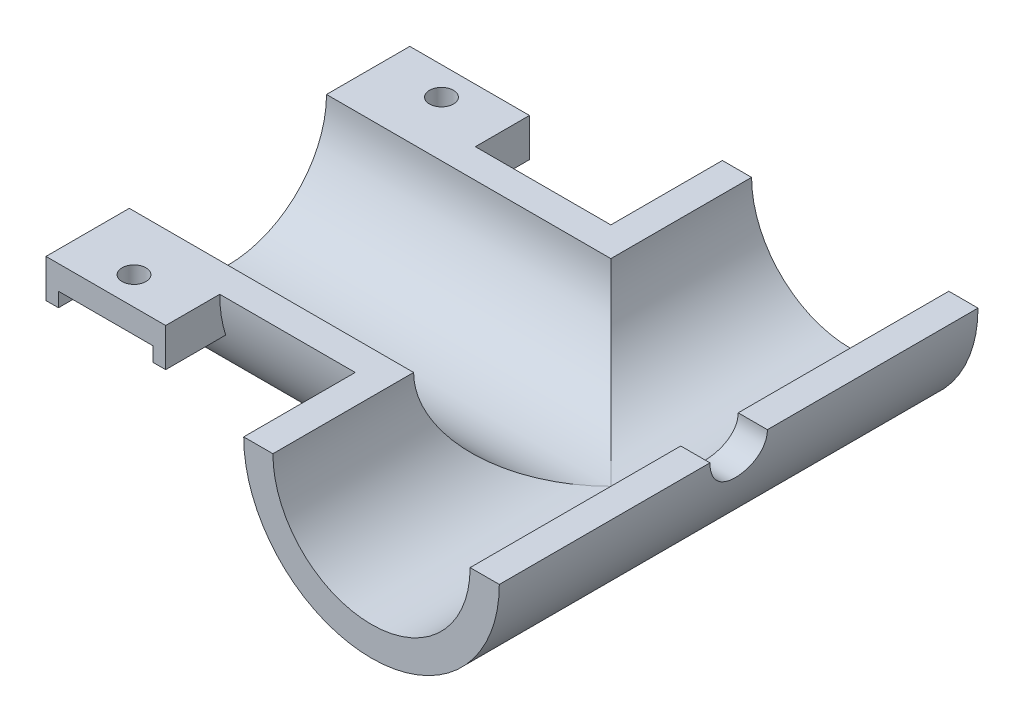
ISO-10303-21;
HEADER;
FILE_DESCRIPTION(('STEP AP214'),'2;1');
FILE_NAME('part.step','',(''),(''),'','','');
FILE_SCHEMA(('AUTOMOTIVE_DESIGN { 1 0 10303 214 1 1 1 1 }'));
ENDSEC;
DATA;
#1=APPLICATION_CONTEXT('core data for automotive mechanical design processes');
#2=APPLICATION_PROTOCOL_DEFINITION('international standard','automotive_design',2000,#1);
#3=PRODUCT_CONTEXT('',#1,'mechanical');
#4=PRODUCT('Part','Part','',(#3));
#5=PRODUCT_RELATED_PRODUCT_CATEGORY('part','',(#4));
#6=PRODUCT_DEFINITION_FORMATION('','',#4);
#7=PRODUCT_DEFINITION_CONTEXT('part definition',#1,'design');
#8=PRODUCT_DEFINITION('design','',#6,#7);
#9=PRODUCT_DEFINITION_SHAPE('','',#8);
#10=(LENGTH_UNIT() NAMED_UNIT(*) SI_UNIT(.MILLI.,.METRE.));
#11=(NAMED_UNIT(*) PLANE_ANGLE_UNIT() SI_UNIT($,.RADIAN.));
#12=(NAMED_UNIT(*) SI_UNIT($,.STERADIAN.) SOLID_ANGLE_UNIT());
#13=UNCERTAINTY_MEASURE_WITH_UNIT(LENGTH_MEASURE(1.E-05),#10,'distance_accuracy_value','');
#14=(GEOMETRIC_REPRESENTATION_CONTEXT(3) GLOBAL_UNCERTAINTY_ASSIGNED_CONTEXT((#13)) GLOBAL_UNIT_ASSIGNED_CONTEXT((#10,
#11,#12)) REPRESENTATION_CONTEXT('',''));
#15=CARTESIAN_POINT('',(0.,0.,0.));
#16=DIRECTION('',(0.,0.,1.));
#17=DIRECTION('',(1.,0.,0.));
#18=AXIS2_PLACEMENT_3D('',#15,#16,#17);
#19=CARTESIAN_POINT('',(1.651,-5.08,31.751));
#20=DIRECTION('',(-1.,0.,0.));
#21=DIRECTION('',(0.,0.,-1.));
#22=AXIS2_PLACEMENT_3D('',#19,#20,#21);
#23=PLANE('',#22);
#24=DIRECTION('',(0.,0.,-1.));
#25=VECTOR('',#24,1.);
#26=CARTESIAN_POINT('',(1.651,-3.175,31.751));
#27=LINE('',#26,#25);
#28=CARTESIAN_POINT('',(1.651,-3.175,-16.6545622953592));
#29=VERTEX_POINT('',#28);
#30=CARTESIAN_POINT('',(1.651,-3.175,-24.13));
#31=VERTEX_POINT('',#30);
#32=EDGE_CURVE('E139',#29,#31,#27,.T.);
#33=ORIENTED_EDGE('',*,*,#32,.F.);
#34=CARTESIAN_POINT('',(1.651,0.,0.));
#35=DIRECTION('',(-1.,0.,0.));
#36=DIRECTION('',(0.,0.,1.));
#37=AXIS2_PLACEMENT_3D('',#34,#35,#36);
#38=CIRCLE('',#37,16.9545);
#39=CARTESIAN_POINT('',(1.651,-5.08,-16.1755578033649));
#40=VERTEX_POINT('',#39);
#41=EDGE_CURVE('E120',#29,#40,#38,.T.);
#42=ORIENTED_EDGE('',*,*,#41,.T.);
#43=DIRECTION('',(0.,0.,-1.));
#44=VECTOR('',#43,1.);
#45=CARTESIAN_POINT('',(1.651,-5.08,31.751));
#46=LINE('',#45,#44);
#47=CARTESIAN_POINT('',(1.651,-5.08,-24.13));
#48=VERTEX_POINT('',#47);
#49=EDGE_CURVE('E142',#40,#48,#46,.T.);
#50=ORIENTED_EDGE('',*,*,#49,.T.);
#51=DIRECTION('',(0.,-1.,0.));
#52=VECTOR('',#51,1.);
#53=CARTESIAN_POINT('',(1.651,-5.08,-24.13));
#54=LINE('',#53,#52);
#55=EDGE_CURVE('E136',#31,#48,#54,.T.);
#56=ORIENTED_EDGE('',*,*,#55,.F.);
#57=EDGE_LOOP('',(#33,#42,#50,#56));
#58=FACE_BOUND('',#57,.T.);
#59=ADVANCED_FACE('F33',(#58),#23,.F.);
#60=CARTESIAN_POINT('',(0.,-5.08,31.751));
#61=DIRECTION('',(0.,-1.,0.));
#62=DIRECTION('',(0.,0.,1.));
#63=AXIS2_PLACEMENT_3D('',#60,#61,#62);
#64=PLANE('',#63);
#65=ORIENTED_EDGE('',*,*,#49,.F.);
#66=DIRECTION('',(-1.,0.,0.));
#67=VECTOR('',#66,1.);
#68=CARTESIAN_POINT('',(50.8,-5.08,-16.1755578033649));
#69=LINE('',#68,#67);
#70=CARTESIAN_POINT('',(0.,-5.08,-16.1755578033649));
#71=VERTEX_POINT('',#70);
#72=EDGE_CURVE('E12',#71,#40,#69,.F.);
#73=ORIENTED_EDGE('',*,*,#72,.F.);
#74=DIRECTION('',(0.,0.,-1.));
#75=VECTOR('',#74,1.);
#76=CARTESIAN_POINT('',(0.,-5.08,31.751));
#77=LINE('',#76,#75);
#78=CARTESIAN_POINT('',(0.,-5.08,-24.13));
#79=VERTEX_POINT('',#78);
#80=EDGE_CURVE('E112',#71,#79,#77,.T.);
#81=ORIENTED_EDGE('',*,*,#80,.T.);
#82=DIRECTION('',(1.,0.,0.));
#83=VECTOR('',#82,1.);
#84=CARTESIAN_POINT('',(0.,-5.08,-24.13));
#85=LINE('',#84,#83);
#86=EDGE_CURVE('E92',#79,#48,#85,.T.);
#87=ORIENTED_EDGE('',*,*,#86,.T.);
#88=EDGE_LOOP('',(#65,#73,#81,#87));
#89=FACE_BOUND('',#88,.T.);
#90=ADVANCED_FACE('F484',(#89),#64,.T.);
#91=CARTESIAN_POINT('',(0.,0.,31.751));
#92=DIRECTION('',(-1.,0.,0.));
#93=DIRECTION('',(0.,-1.,0.));
#94=AXIS2_PLACEMENT_3D('',#91,#92,#93);
#95=PLANE('',#94);
#96=DIRECTION('',(0.,0.,-1.));
#97=VECTOR('',#96,1.);
#98=CARTESIAN_POINT('',(0.,0.,31.751));
#99=LINE('',#98,#97);
#100=CARTESIAN_POINT('',(0.,0.,-13.081));
#101=VERTEX_POINT('',#100);
#102=CARTESIAN_POINT('',(0.,0.,-24.13));
#103=VERTEX_POINT('',#102);
#104=EDGE_CURVE('E109',#101,#103,#99,.T.);
#105=ORIENTED_EDGE('',*,*,#104,.T.);
#106=DIRECTION('',(0.,-1.,0.));
#107=VECTOR('',#106,1.);
#108=CARTESIAN_POINT('',(0.,0.,-24.13));
#109=LINE('',#108,#107);
#110=EDGE_CURVE('E98',#103,#79,#109,.T.);
#111=ORIENTED_EDGE('',*,*,#110,.T.);
#112=ORIENTED_EDGE('',*,*,#80,.F.);
#113=CARTESIAN_POINT('',(0.,0.,0.));
#114=DIRECTION('',(1.,0.,0.));
#115=DIRECTION('',(0.,0.,-1.));
#116=AXIS2_PLACEMENT_3D('',#113,#114,#115);
#117=CIRCLE('',#116,16.9545);
#118=CARTESIAN_POINT('',(0.,-5.08,16.1755578033649));
#119=VERTEX_POINT('',#118);
#120=EDGE_CURVE('E418',#119,#71,#117,.T.);
#121=ORIENTED_EDGE('',*,*,#120,.F.);
#122=DIRECTION('',(0.,0.,1.));
#123=VECTOR('',#122,1.);
#124=CARTESIAN_POINT('',(0.,-5.08,-31.751));
#125=LINE('',#124,#123);
#126=CARTESIAN_POINT('',(0.,-5.08,24.13));
#127=VERTEX_POINT('',#126);
#128=EDGE_CURVE('E342',#119,#127,#125,.T.);
#129=ORIENTED_EDGE('',*,*,#128,.T.);
#130=DIRECTION('',(0.,-1.,0.));
#131=VECTOR('',#130,1.);
#132=CARTESIAN_POINT('',(0.,0.,24.13));
#133=LINE('',#132,#131);
#134=CARTESIAN_POINT('',(0.,0.,24.13));
#135=VERTEX_POINT('',#134);
#136=EDGE_CURVE('E350',#135,#127,#133,.T.);
#137=ORIENTED_EDGE('',*,*,#136,.F.);
#138=DIRECTION('',(0.,0.,1.));
#139=VECTOR('',#138,1.);
#140=CARTESIAN_POINT('',(0.,0.,-31.751));
#141=LINE('',#140,#139);
#142=CARTESIAN_POINT('',(0.,0.,13.081));
#143=VERTEX_POINT('',#142);
#144=EDGE_CURVE('E345',#143,#135,#141,.T.);
#145=ORIENTED_EDGE('',*,*,#144,.F.);
#146=CARTESIAN_POINT('',(0.,0.,0.));
#147=DIRECTION('',(-1.,0.,0.));
#148=DIRECTION('',(0.,0.,1.));
#149=AXIS2_PLACEMENT_3D('',#146,#147,#148);
#150=CIRCLE('',#149,13.081);
#151=EDGE_CURVE('E724',#101,#143,#150,.T.);
#152=ORIENTED_EDGE('',*,*,#151,.F.);
#153=EDGE_LOOP('',(#105,#111,#112,#121,#129,#137,#145,#152));
#154=FACE_BOUND('',#153,.T.);
#155=ADVANCED_FACE('F414',(#154),#95,.T.);
#156=CARTESIAN_POINT('',(0.,0.,-24.13));
#157=DIRECTION('',(0.,0.,-1.));
#158=DIRECTION('',(1.,0.,0.));
#159=AXIS2_PLACEMENT_3D('',#156,#157,#158);
#160=PLANE('',#159);
#161=ORIENTED_EDGE('',*,*,#55,.T.);
#162=ORIENTED_EDGE('',*,*,#86,.F.);
#163=ORIENTED_EDGE('',*,*,#110,.F.);
#164=DIRECTION('',(-1.,0.,0.));
#165=VECTOR('',#164,1.);
#166=CARTESIAN_POINT('',(0.,0.,-24.13));
#167=LINE('',#166,#165);
#168=CARTESIAN_POINT('',(15.875,0.,-24.13));
#169=VERTEX_POINT('',#168);
#170=EDGE_CURVE('E91',#169,#103,#167,.T.);
#171=ORIENTED_EDGE('',*,*,#170,.F.);
#172=DIRECTION('',(0.,1.,0.));
#173=VECTOR('',#172,1.);
#174=CARTESIAN_POINT('',(15.875,0.,-24.13));
#175=LINE('',#174,#173);
#176=CARTESIAN_POINT('',(15.875,-5.08,-24.13));
#177=VERTEX_POINT('',#176);
#178=EDGE_CURVE('E80',#177,#169,#175,.T.);
#179=ORIENTED_EDGE('',*,*,#178,.F.);
#180=CARTESIAN_POINT('',(14.224,-5.08,-24.13));
#181=VERTEX_POINT('',#180);
#182=EDGE_CURVE('E149',#181,#177,#85,.T.);
#183=ORIENTED_EDGE('',*,*,#182,.F.);
#184=DIRECTION('',(0.,1.,0.));
#185=VECTOR('',#184,1.);
#186=CARTESIAN_POINT('',(14.224,-5.08,-24.13));
#187=LINE('',#186,#185);
#188=CARTESIAN_POINT('',(14.224,-3.175,-24.13));
#189=VERTEX_POINT('',#188);
#190=EDGE_CURVE('E133',#181,#189,#187,.T.);
#191=ORIENTED_EDGE('',*,*,#190,.T.);
#192=DIRECTION('',(-1.,0.,0.));
#193=VECTOR('',#192,1.);
#194=CARTESIAN_POINT('',(1.651,-3.175,-24.13));
#195=LINE('',#194,#193);
#196=EDGE_CURVE('E117',#189,#31,#195,.T.);
#197=ORIENTED_EDGE('',*,*,#196,.T.);
#198=EDGE_LOOP('',(#161,#162,#163,#171,#179,#183,#191,#197));
#199=FACE_BOUND('',#198,.T.);
#200=ADVANCED_FACE('F95',(#199),#160,.T.);
#201=CARTESIAN_POINT('',(15.875,0.,31.751));
#202=DIRECTION('',(1.,0.,0.));
#203=DIRECTION('',(0.,0.,1.));
#204=AXIS2_PLACEMENT_3D('',#201,#202,#203);
#205=PLANE('',#204);
#206=DIRECTION('',(0.,0.,-1.));
#207=VECTOR('',#206,1.);
#208=CARTESIAN_POINT('',(15.875,-5.08,31.751));
#209=LINE('',#208,#207);
#210=CARTESIAN_POINT('',(15.875,-5.08,-16.1755578033649));
#211=VERTEX_POINT('',#210);
#212=EDGE_CURVE('E88',#211,#177,#209,.T.);
#213=ORIENTED_EDGE('',*,*,#212,.T.);
#214=ORIENTED_EDGE('',*,*,#178,.T.);
#215=DIRECTION('',(0.,0.,-1.));
#216=VECTOR('',#215,1.);
#217=CARTESIAN_POINT('',(15.875,0.,31.751));
#218=LINE('',#217,#216);
#219=CARTESIAN_POINT('',(15.875,0.,-16.9545));
#220=VERTEX_POINT('',#219);
#221=EDGE_CURVE('E86',#220,#169,#218,.T.);
#222=ORIENTED_EDGE('',*,*,#221,.F.);
#223=CARTESIAN_POINT('',(15.875,0.,0.));
#224=DIRECTION('',(-1.,0.,0.));
#225=DIRECTION('',(0.,0.,1.));
#226=AXIS2_PLACEMENT_3D('',#223,#224,#225);
#227=CIRCLE('',#226,16.9545);
#228=EDGE_CURVE('E118',#211,#220,#227,.F.);
#229=ORIENTED_EDGE('',*,*,#228,.F.);
#230=EDGE_LOOP('',(#213,#214,#222,#229));
#231=FACE_BOUND('',#230,.T.);
#232=ADVANCED_FACE('F82',(#231),#205,.T.);
#233=CARTESIAN_POINT('',(0.,0.,31.751));
#234=DIRECTION('',(0.,1.,0.));
#235=DIRECTION('',(0.,0.,-1.));
#236=AXIS2_PLACEMENT_3D('',#233,#234,#235);
#237=PLANE('',#236);
#238=CARTESIAN_POINT('',(7.9375,0.,-20.3922811476796));
#239=DIRECTION('',(0.,1.,0.));
#240=DIRECTION('',(0.,0.,1.));
#241=AXIS2_PLACEMENT_3D('',#238,#239,#240);
#242=CIRCLE('',#241,1.5875);
#243=CARTESIAN_POINT('',(7.9375,0.,-18.8047811476796));
#244=VERTEX_POINT('',#243);
#245=EDGE_CURVE('E699',#244,#244,#242,.F.);
#246=ORIENTED_EDGE('',*,*,#245,.T.);
#247=EDGE_LOOP('',(#246));
#248=FACE_BOUND('',#247,.T.);
#249=ORIENTED_EDGE('',*,*,#221,.T.);
#250=ORIENTED_EDGE('',*,*,#170,.T.);
#251=ORIENTED_EDGE('',*,*,#104,.F.);
#252=DIRECTION('',(-1.,0.,0.));
#253=VECTOR('',#252,1.);
#254=CARTESIAN_POINT('',(50.8,0.,-13.081));
#255=LINE('',#254,#253);
#256=CARTESIAN_POINT('',(37.719,0.,-13.081));
#257=VERTEX_POINT('',#256);
#258=EDGE_CURVE('E279',#101,#257,#255,.F.);
#259=ORIENTED_EDGE('',*,*,#258,.T.);
#260=DIRECTION('',(0.,0.,-1.));
#261=VECTOR('',#260,1.);
#262=CARTESIAN_POINT('',(37.719,0.,31.75));
#263=LINE('',#262,#261);
#264=CARTESIAN_POINT('',(37.719,0.,-31.75));
#265=VERTEX_POINT('',#264);
#266=EDGE_CURVE('E280',#257,#265,#263,.T.);
#267=ORIENTED_EDGE('',*,*,#266,.T.);
#268=DIRECTION('',(-1.,0.,0.));
#269=VECTOR('',#268,1.);
#270=CARTESIAN_POINT('',(50.8,0.,-31.75));
#271=LINE('',#270,#269);
#272=CARTESIAN_POINT('',(33.8455,0.,-31.75));
#273=VERTEX_POINT('',#272);
#274=EDGE_CURVE('E294',#265,#273,#271,.T.);
#275=ORIENTED_EDGE('',*,*,#274,.T.);
#276=DIRECTION('',(0.,0.,-1.));
#277=VECTOR('',#276,1.);
#278=CARTESIAN_POINT('',(33.8455,0.,31.75));
#279=LINE('',#278,#277);
#280=CARTESIAN_POINT('',(33.8455,0.,-16.9545));
#281=VERTEX_POINT('',#280);
#282=EDGE_CURVE('E286',#273,#281,#279,.F.);
#283=ORIENTED_EDGE('',*,*,#282,.T.);
#284=DIRECTION('',(-1.,0.,0.));
#285=VECTOR('',#284,1.);
#286=CARTESIAN_POINT('',(50.8,0.,-16.9545));
#287=LINE('',#286,#285);
#288=EDGE_CURVE('E108',#281,#220,#287,.T.);
#289=ORIENTED_EDGE('',*,*,#288,.T.);
#290=EDGE_LOOP('',(#249,#250,#251,#259,#267,#275,#283,#289));
#291=FACE_BOUND('',#290,.T.);
#292=ADVANCED_FACE('F105',(#248,#291),#237,.T.);
#293=CARTESIAN_POINT('',(1.651,-3.175,31.751));
#294=DIRECTION('',(0.,1.,0.));
#295=DIRECTION('',(0.,0.,-1.));
#296=AXIS2_PLACEMENT_3D('',#293,#294,#295);
#297=PLANE('',#296);
#298=CARTESIAN_POINT('',(7.9375,-3.175,-20.3922811476796));
#299=DIRECTION('',(0.,1.,0.));
#300=DIRECTION('',(0.,0.,1.));
#301=AXIS2_PLACEMENT_3D('',#298,#299,#300);
#302=CIRCLE('',#301,1.5875);
#303=CARTESIAN_POINT('',(7.9375,-3.175,-18.8047811476796));
#304=VERTEX_POINT('',#303);
#305=EDGE_CURVE('E702',#304,#304,#302,.T.);
#306=ORIENTED_EDGE('',*,*,#305,.T.);
#307=EDGE_LOOP('',(#306));
#308=FACE_BOUND('',#307,.T.);
#309=DIRECTION('',(0.,0.,-1.));
#310=VECTOR('',#309,1.);
#311=CARTESIAN_POINT('',(14.224,-3.175,31.751));
#312=LINE('',#311,#310);
#313=CARTESIAN_POINT('',(14.224,-3.175,-16.6545622953592));
#314=VERTEX_POINT('',#313);
#315=EDGE_CURVE('E141',#314,#189,#312,.T.);
#316=ORIENTED_EDGE('',*,*,#315,.F.);
#317=DIRECTION('',(-1.,0.,0.));
#318=VECTOR('',#317,1.);
#319=CARTESIAN_POINT('',(50.8,-3.175,-16.6545622953592));
#320=LINE('',#319,#318);
#321=EDGE_CURVE('E52',#314,#29,#320,.T.);
#322=ORIENTED_EDGE('',*,*,#321,.T.);
#323=ORIENTED_EDGE('',*,*,#32,.T.);
#324=ORIENTED_EDGE('',*,*,#196,.F.);
#325=EDGE_LOOP('',(#316,#322,#323,#324));
#326=FACE_BOUND('',#325,.T.);
#327=ADVANCED_FACE('F163',(#308,#326),#297,.F.);
#328=DIRECTION('',(0.,0.,-1.));
#329=VECTOR('',#328,1.);
#330=CARTESIAN_POINT('',(14.224,-5.08,31.751));
#331=LINE('',#330,#329);
#332=CARTESIAN_POINT('',(14.224,-5.08,-16.1755578033649));
#333=VERTEX_POINT('',#332);
#334=EDGE_CURVE('E138',#333,#181,#331,.T.);
#335=ORIENTED_EDGE('',*,*,#334,.T.);
#336=ORIENTED_EDGE('',*,*,#182,.T.);
#337=ORIENTED_EDGE('',*,*,#212,.F.);
#338=EDGE_CURVE('E43',#333,#211,#69,.F.);
#339=ORIENTED_EDGE('',*,*,#338,.F.);
#340=EDGE_LOOP('',(#335,#336,#337,#339));
#341=FACE_BOUND('',#340,.T.);
#342=ADVANCED_FACE('F35',(#341),#64,.T.);
#343=CARTESIAN_POINT('',(14.224,-5.08,31.751));
#344=DIRECTION('',(1.,0.,0.));
#345=DIRECTION('',(0.,0.,1.));
#346=AXIS2_PLACEMENT_3D('',#343,#344,#345);
#347=PLANE('',#346);
#348=ORIENTED_EDGE('',*,*,#334,.F.);
#349=CARTESIAN_POINT('',(14.224,0.,0.));
#350=DIRECTION('',(1.,0.,0.));
#351=DIRECTION('',(0.,0.,-1.));
#352=AXIS2_PLACEMENT_3D('',#349,#350,#351);
#353=CIRCLE('',#352,16.9545);
#354=EDGE_CURVE('E102',#333,#314,#353,.T.);
#355=ORIENTED_EDGE('',*,*,#354,.T.);
#356=ORIENTED_EDGE('',*,*,#315,.T.);
#357=ORIENTED_EDGE('',*,*,#190,.F.);
#358=EDGE_LOOP('',(#348,#355,#356,#357));
#359=FACE_BOUND('',#358,.T.);
#360=ADVANCED_FACE('F159',(#359),#347,.F.);
#361=CARTESIAN_POINT('',(1.651,-5.08,-31.751));
#362=DIRECTION('',(-1.,0.,0.));
#363=DIRECTION('',(0.,0.,1.));
#364=AXIS2_PLACEMENT_3D('',#361,#362,#363);
#365=PLANE('',#364);
#366=DIRECTION('',(0.,0.,1.));
#367=VECTOR('',#366,1.);
#368=CARTESIAN_POINT('',(1.651,-3.175,-31.751));
#369=LINE('',#368,#367);
#370=CARTESIAN_POINT('',(1.651,-3.175,16.6545622953592));
#371=VERTEX_POINT('',#370);
#372=CARTESIAN_POINT('',(1.651,-3.175,24.13));
#373=VERTEX_POINT('',#372);
#374=EDGE_CURVE('E368',#371,#373,#369,.T.);
#375=ORIENTED_EDGE('',*,*,#374,.T.);
#376=DIRECTION('',(0.,-1.,0.));
#377=VECTOR('',#376,1.);
#378=CARTESIAN_POINT('',(1.651,-5.08,24.13));
#379=LINE('',#378,#377);
#380=CARTESIAN_POINT('',(1.651,-5.08,24.13));
#381=VERTEX_POINT('',#380);
#382=EDGE_CURVE('E372',#373,#381,#379,.T.);
#383=ORIENTED_EDGE('',*,*,#382,.T.);
#384=DIRECTION('',(0.,0.,1.));
#385=VECTOR('',#384,1.);
#386=CARTESIAN_POINT('',(1.651,-5.08,-31.751));
#387=LINE('',#386,#385);
#388=CARTESIAN_POINT('',(1.651,-5.08,16.1755578033649));
#389=VERTEX_POINT('',#388);
#390=EDGE_CURVE('E146',#389,#381,#387,.T.);
#391=ORIENTED_EDGE('',*,*,#390,.F.);
#392=CARTESIAN_POINT('',(1.651,0.,0.));
#393=DIRECTION('',(-1.,0.,0.));
#394=DIRECTION('',(0.,0.,1.));
#395=AXIS2_PLACEMENT_3D('',#392,#393,#394);
#396=CIRCLE('',#395,16.9545);
#397=EDGE_CURVE('E381',#389,#371,#396,.T.);
#398=ORIENTED_EDGE('',*,*,#397,.T.);
#399=EDGE_LOOP('',(#375,#383,#391,#398));
#400=FACE_BOUND('',#399,.T.);
#401=ADVANCED_FACE('F408',(#400),#365,.F.);
#402=CARTESIAN_POINT('',(1.651,-3.175,-31.751));
#403=DIRECTION('',(0.,1.,0.));
#404=DIRECTION('',(0.,0.,1.));
#405=AXIS2_PLACEMENT_3D('',#402,#403,#404);
#406=PLANE('',#405);
#407=CARTESIAN_POINT('',(7.9375,-3.175,20.3922811476796));
#408=DIRECTION('',(0.,-1.,0.));
#409=DIRECTION('',(0.,0.,-1.));
#410=AXIS2_PLACEMENT_3D('',#407,#408,#409);
#411=CIRCLE('',#410,1.5875);
#412=CARTESIAN_POINT('',(7.9375,-3.175,18.8047811476796));
#413=VERTEX_POINT('',#412);
#414=EDGE_CURVE('E697',#413,#413,#411,.T.);
#415=ORIENTED_EDGE('',*,*,#414,.F.);
#416=EDGE_LOOP('',(#415));
#417=FACE_BOUND('',#416,.T.);
#418=DIRECTION('',(0.,0.,1.));
#419=VECTOR('',#418,1.);
#420=CARTESIAN_POINT('',(14.224,-3.175,-31.751));
#421=LINE('',#420,#419);
#422=CARTESIAN_POINT('',(14.224,-3.175,16.6545622953592));
#423=VERTEX_POINT('',#422);
#424=CARTESIAN_POINT('',(14.224,-3.175,24.13));
#425=VERTEX_POINT('',#424);
#426=EDGE_CURVE('E371',#423,#425,#421,.T.);
#427=ORIENTED_EDGE('',*,*,#426,.T.);
#428=DIRECTION('',(-1.,0.,0.));
#429=VECTOR('',#428,1.);
#430=CARTESIAN_POINT('',(1.651,-3.175,24.13));
#431=LINE('',#430,#429);
#432=EDGE_CURVE('E344',#425,#373,#431,.T.);
#433=ORIENTED_EDGE('',*,*,#432,.T.);
#434=ORIENTED_EDGE('',*,*,#374,.F.);
#435=DIRECTION('',(-1.,0.,0.));
#436=VECTOR('',#435,1.);
#437=CARTESIAN_POINT('',(50.8,-3.175,16.6545622953592));
#438=LINE('',#437,#436);
#439=EDGE_CURVE('E384',#371,#423,#438,.F.);
#440=ORIENTED_EDGE('',*,*,#439,.T.);
#441=EDGE_LOOP('',(#427,#433,#434,#440));
#442=FACE_BOUND('',#441,.T.);
#443=ADVANCED_FACE('F404',(#417,#442),#406,.F.);
#444=CARTESIAN_POINT('',(0.,-5.08,-31.751));
#445=DIRECTION('',(0.,-1.,0.));
#446=DIRECTION('',(0.,0.,-1.));
#447=AXIS2_PLACEMENT_3D('',#444,#445,#446);
#448=PLANE('',#447);
#449=ORIENTED_EDGE('',*,*,#390,.T.);
#450=DIRECTION('',(1.,0.,0.));
#451=VECTOR('',#450,1.);
#452=CARTESIAN_POINT('',(0.,-5.08,24.13));
#453=LINE('',#452,#451);
#454=EDGE_CURVE('E356',#127,#381,#453,.T.);
#455=ORIENTED_EDGE('',*,*,#454,.F.);
#456=ORIENTED_EDGE('',*,*,#128,.F.);
#457=DIRECTION('',(-1.,0.,0.));
#458=VECTOR('',#457,1.);
#459=CARTESIAN_POINT('',(50.8,-5.08,16.1755578033649));
#460=LINE('',#459,#458);
#461=EDGE_CURVE('E337',#119,#389,#460,.F.);
#462=ORIENTED_EDGE('',*,*,#461,.T.);
#463=EDGE_LOOP('',(#449,#455,#456,#462));
#464=FACE_BOUND('',#463,.T.);
#465=ADVANCED_FACE('F411',(#464),#448,.T.);
#466=CARTESIAN_POINT('',(0.,0.,24.13));
#467=DIRECTION('',(0.,0.,1.));
#468=DIRECTION('',(1.,0.,0.));
#469=AXIS2_PLACEMENT_3D('',#466,#467,#468);
#470=PLANE('',#469);
#471=ORIENTED_EDGE('',*,*,#382,.F.);
#472=ORIENTED_EDGE('',*,*,#432,.F.);
#473=DIRECTION('',(0.,1.,0.));
#474=VECTOR('',#473,1.);
#475=CARTESIAN_POINT('',(14.224,-5.08,24.13));
#476=LINE('',#475,#474);
#477=CARTESIAN_POINT('',(14.224,-5.08,24.13));
#478=VERTEX_POINT('',#477);
#479=EDGE_CURVE('E376',#478,#425,#476,.T.);
#480=ORIENTED_EDGE('',*,*,#479,.F.);
#481=CARTESIAN_POINT('',(15.875,-5.08,24.13));
#482=VERTEX_POINT('',#481);
#483=EDGE_CURVE('E355',#478,#482,#453,.T.);
#484=ORIENTED_EDGE('',*,*,#483,.T.);
#485=DIRECTION('',(0.,1.,0.));
#486=VECTOR('',#485,1.);
#487=CARTESIAN_POINT('',(15.875,0.,24.13));
#488=LINE('',#487,#486);
#489=CARTESIAN_POINT('',(15.875,0.,24.13));
#490=VERTEX_POINT('',#489);
#491=EDGE_CURVE('E359',#482,#490,#488,.T.);
#492=ORIENTED_EDGE('',*,*,#491,.T.);
#493=DIRECTION('',(-1.,0.,0.));
#494=VECTOR('',#493,1.);
#495=CARTESIAN_POINT('',(0.,0.,24.13));
#496=LINE('',#495,#494);
#497=EDGE_CURVE('E362',#490,#135,#496,.T.);
#498=ORIENTED_EDGE('',*,*,#497,.T.);
#499=ORIENTED_EDGE('',*,*,#136,.T.);
#500=ORIENTED_EDGE('',*,*,#454,.T.);
#501=EDGE_LOOP('',(#471,#472,#480,#484,#492,#498,#499,#500));
#502=FACE_BOUND('',#501,.T.);
#503=ADVANCED_FACE('F399',(#502),#470,.T.);
#504=CARTESIAN_POINT('',(15.875,0.,-31.751));
#505=DIRECTION('',(1.,0.,0.));
#506=DIRECTION('',(0.,0.,-1.));
#507=AXIS2_PLACEMENT_3D('',#504,#505,#506);
#508=PLANE('',#507);
#509=DIRECTION('',(0.,0.,1.));
#510=VECTOR('',#509,1.);
#511=CARTESIAN_POINT('',(15.875,-5.08,-31.751));
#512=LINE('',#511,#510);
#513=CARTESIAN_POINT('',(15.875,-5.08,16.1755578033649));
#514=VERTEX_POINT('',#513);
#515=EDGE_CURVE('E346',#514,#482,#512,.T.);
#516=ORIENTED_EDGE('',*,*,#515,.F.);
#517=CARTESIAN_POINT('',(15.875,0.,0.));
#518=DIRECTION('',(1.,0.,0.));
#519=DIRECTION('',(0.,0.,-1.));
#520=AXIS2_PLACEMENT_3D('',#517,#518,#519);
#521=CIRCLE('',#520,16.9545);
#522=CARTESIAN_POINT('',(15.875,0.,16.9545));
#523=VERTEX_POINT('',#522);
#524=EDGE_CURVE('E327',#514,#523,#521,.F.);
#525=ORIENTED_EDGE('',*,*,#524,.T.);
#526=DIRECTION('',(0.,0.,1.));
#527=VECTOR('',#526,1.);
#528=CARTESIAN_POINT('',(15.875,0.,-31.751));
#529=LINE('',#528,#527);
#530=EDGE_CURVE('E349',#523,#490,#529,.T.);
#531=ORIENTED_EDGE('',*,*,#530,.T.);
#532=ORIENTED_EDGE('',*,*,#491,.F.);
#533=EDGE_LOOP('',(#516,#525,#531,#532));
#534=FACE_BOUND('',#533,.T.);
#535=ADVANCED_FACE('F620',(#534),#508,.T.);
#536=CARTESIAN_POINT('',(0.,0.,-31.751));
#537=DIRECTION('',(0.,1.,0.));
#538=DIRECTION('',(0.,0.,1.));
#539=AXIS2_PLACEMENT_3D('',#536,#537,#538);
#540=PLANE('',#539);
#541=CARTESIAN_POINT('',(7.9375,0.,20.3922811476796));
#542=DIRECTION('',(0.,1.,0.));
#543=DIRECTION('',(0.,0.,1.));
#544=AXIS2_PLACEMENT_3D('',#541,#542,#543);
#545=CIRCLE('',#544,1.5875);
#546=CARTESIAN_POINT('',(7.9375,0.,21.9797811476796));
#547=VERTEX_POINT('',#546);
#548=EDGE_CURVE('E37',#547,#547,#545,.T.);
#549=ORIENTED_EDGE('',*,*,#548,.F.);
#550=EDGE_LOOP('',(#549));
#551=FACE_BOUND('',#550,.T.);
#552=ORIENTED_EDGE('',*,*,#530,.F.);
#553=DIRECTION('',(-1.,0.,0.));
#554=VECTOR('',#553,1.);
#555=CARTESIAN_POINT('',(50.8,0.,16.9545));
#556=LINE('',#555,#554);
#557=CARTESIAN_POINT('',(33.8455,0.,16.9545));
#558=VERTEX_POINT('',#557);
#559=EDGE_CURVE('E308',#523,#558,#556,.F.);
#560=ORIENTED_EDGE('',*,*,#559,.T.);
#561=CARTESIAN_POINT('',(33.8455,0.,31.75));
#562=VERTEX_POINT('',#561);
#563=EDGE_CURVE('E296',#558,#562,#279,.F.);
#564=ORIENTED_EDGE('',*,*,#563,.T.);
#565=DIRECTION('',(-1.,0.,0.));
#566=VECTOR('',#565,1.);
#567=CARTESIAN_POINT('',(50.8,0.,31.75));
#568=LINE('',#567,#566);
#569=CARTESIAN_POINT('',(37.719,0.,31.75));
#570=VERTEX_POINT('',#569);
#571=EDGE_CURVE('E304',#570,#562,#568,.T.);
#572=ORIENTED_EDGE('',*,*,#571,.F.);
#573=CARTESIAN_POINT('',(37.719,0.,13.081));
#574=VERTEX_POINT('',#573);
#575=EDGE_CURVE('E298',#570,#574,#263,.T.);
#576=ORIENTED_EDGE('',*,*,#575,.T.);
#577=DIRECTION('',(-1.,0.,0.));
#578=VECTOR('',#577,1.);
#579=CARTESIAN_POINT('',(50.8,0.,13.081));
#580=LINE('',#579,#578);
#581=EDGE_CURVE('E710',#574,#143,#580,.T.);
#582=ORIENTED_EDGE('',*,*,#581,.T.);
#583=ORIENTED_EDGE('',*,*,#144,.T.);
#584=ORIENTED_EDGE('',*,*,#497,.F.);
#585=EDGE_LOOP('',(#552,#560,#564,#572,#576,#582,#583,#584));
#586=FACE_BOUND('',#585,.T.);
#587=ADVANCED_FACE('F618',(#551,#586),#540,.T.);
#588=DIRECTION('',(0.,0.,1.));
#589=VECTOR('',#588,1.);
#590=CARTESIAN_POINT('',(14.224,-5.08,-31.751));
#591=LINE('',#590,#589);
#592=CARTESIAN_POINT('',(14.224,-5.08,16.1755578033649));
#593=VERTEX_POINT('',#592);
#594=EDGE_CURVE('E369',#593,#478,#591,.T.);
#595=ORIENTED_EDGE('',*,*,#594,.F.);
#596=EDGE_CURVE('E331',#593,#514,#460,.F.);
#597=ORIENTED_EDGE('',*,*,#596,.T.);
#598=ORIENTED_EDGE('',*,*,#515,.T.);
#599=ORIENTED_EDGE('',*,*,#483,.F.);
#600=EDGE_LOOP('',(#595,#597,#598,#599));
#601=FACE_BOUND('',#600,.T.);
#602=ADVANCED_FACE('F395',(#601),#448,.T.);
#603=CARTESIAN_POINT('',(14.224,-5.08,-31.751));
#604=DIRECTION('',(1.,0.,0.));
#605=DIRECTION('',(0.,0.,-1.));
#606=AXIS2_PLACEMENT_3D('',#603,#604,#605);
#607=PLANE('',#606);
#608=ORIENTED_EDGE('',*,*,#594,.T.);
#609=ORIENTED_EDGE('',*,*,#479,.T.);
#610=ORIENTED_EDGE('',*,*,#426,.F.);
#611=CARTESIAN_POINT('',(14.224,0.,0.));
#612=DIRECTION('',(1.,0.,0.));
#613=DIRECTION('',(0.,0.,-1.));
#614=AXIS2_PLACEMENT_3D('',#611,#612,#613);
#615=CIRCLE('',#614,16.9545);
#616=EDGE_CURVE('E364',#423,#593,#615,.T.);
#617=ORIENTED_EDGE('',*,*,#616,.T.);
#618=EDGE_LOOP('',(#608,#609,#610,#617));
#619=FACE_BOUND('',#618,.T.);
#620=ADVANCED_FACE('F391',(#619),#607,.F.);
#621=CARTESIAN_POINT('',(50.8,0.,0.));
#622=DIRECTION('',(-1.,0.,0.));
#623=DIRECTION('',(0.,0.,1.));
#624=AXIS2_PLACEMENT_3D('',#621,#622,#623);
#625=CYLINDRICAL_SURFACE('',#624,16.9545);
#626=ORIENTED_EDGE('',*,*,#72,.T.);
#627=ORIENTED_EDGE('',*,*,#41,.F.);
#628=ORIENTED_EDGE('',*,*,#321,.F.);
#629=ORIENTED_EDGE('',*,*,#354,.F.);
#630=ORIENTED_EDGE('',*,*,#338,.T.);
#631=ORIENTED_EDGE('',*,*,#228,.T.);
#632=ORIENTED_EDGE('',*,*,#288,.F.);
#633=CARTESIAN_POINT('',(50.8,0.,0.));
#634=DIRECTION('',(-0.707106781186547,0.,0.707106781186547));
#635=DIRECTION('',(-0.707106781186547,0.,-0.707106781186547));
#636=AXIS2_PLACEMENT_3D('',#633,#634,#635);
#637=ELLIPSE('',#636,23.9772838432546,16.9545);
#638=CARTESIAN_POINT('',(50.8,-16.9545,0.));
#639=VERTEX_POINT('',#638);
#640=EDGE_CURVE('E278',#639,#281,#637,.F.);
#641=ORIENTED_EDGE('',*,*,#640,.F.);
#642=CARTESIAN_POINT('',(50.8,0.,0.));
#643=DIRECTION('',(-0.707106781186547,0.,-0.707106781186547));
#644=DIRECTION('',(-0.707106781186547,0.,0.707106781186547));
#645=AXIS2_PLACEMENT_3D('',#642,#643,#644);
#646=ELLIPSE('',#645,23.9772838432546,16.9545);
#647=EDGE_CURVE('E289',#558,#639,#646,.F.);
#648=ORIENTED_EDGE('',*,*,#647,.F.);
#649=ORIENTED_EDGE('',*,*,#559,.F.);
#650=ORIENTED_EDGE('',*,*,#524,.F.);
#651=ORIENTED_EDGE('',*,*,#596,.F.);
#652=ORIENTED_EDGE('',*,*,#616,.F.);
#653=ORIENTED_EDGE('',*,*,#439,.F.);
#654=ORIENTED_EDGE('',*,*,#397,.F.);
#655=ORIENTED_EDGE('',*,*,#461,.F.);
#656=ORIENTED_EDGE('',*,*,#120,.T.);
#657=EDGE_LOOP('',(#626,#627,#628,#629,#630,#631,#632,#641,#648,#649,#650,#651,#652,#653,#654,
#655,#656));
#658=FACE_BOUND('',#657,.T.);
#659=ADVANCED_FACE('F276',(#658),#625,.T.);
#660=CARTESIAN_POINT('',(67.7545,0.,0.));
#661=DIRECTION('',(-1.,0.,0.));
#662=DIRECTION('',(0.,0.,1.));
#663=AXIS2_PLACEMENT_3D('',#660,#661,#662);
#664=CYLINDRICAL_SURFACE('',#663,3.81);
#665=CARTESIAN_POINT('',(67.7545,0.,3.81));
#666=CARTESIAN_POINT('',(67.7544961322528,-0.211165613715782,3.80999299743646));
#667=CARTESIAN_POINT('',(67.7505149997327,-0.422414602967555,3.79238528087151));
#668=CARTESIAN_POINT('',(67.7350182100405,-0.838902256614382,3.72249860712259));
#669=CARTESIAN_POINT('',(67.7234973720573,-1.04413668679757,3.67019580932636));
#670=CARTESIAN_POINT('',(67.6942026607717,-1.44251678596381,3.53264769634259));
#671=CARTESIAN_POINT('',(67.6764355016048,-1.63567517387164,3.4474377432245));
#672=CARTESIAN_POINT('',(67.6365610709494,-2.00494882474157,3.24660863399541));
#673=CARTESIAN_POINT('',(67.6144538634945,-2.18106433909931,3.13098992653076));
#674=CARTESIAN_POINT('',(67.5678999079981,-2.5142315741131,2.87056039783955));
#675=CARTESIAN_POINT('',(67.5434228145635,-2.67095441440685,2.72533423077463));
#676=CARTESIAN_POINT('',(67.4950993440395,-2.95803456013999,2.41070345653643));
#677=CARTESIAN_POINT('',(67.4712530258948,-3.08838940906087,2.24129659912528));
#678=CARTESIAN_POINT('',(67.4265907415364,-3.32050164067653,1.88065943179212));
#679=CARTESIAN_POINT('',(67.4058135982894,-3.42190567574779,1.68919646256613));
#680=CARTESIAN_POINT('',(67.3700790455536,-3.59097022109943,1.29140274888612));
#681=CARTESIAN_POINT('',(67.3551208985493,-3.65863500789116,1.08507389250674));
#682=CARTESIAN_POINT('',(67.3330275634374,-3.75720696820301,0.66698215885847));
#683=CARTESIAN_POINT('',(67.3257682370252,-3.7886981311885,0.455363669038546));
#684=CARTESIAN_POINT('',(67.3195218816851,-3.81584537689869,0.0297322355989159));
#685=CARTESIAN_POINT('',(67.3205337772764,-3.81150611853848,-0.18428039310481));
#686=CARTESIAN_POINT('',(67.330603287131,-3.76758492185679,-0.604259675723122));
#687=CARTESIAN_POINT('',(67.3395053071518,-3.72868449868483,-0.810301901102371));
#688=CARTESIAN_POINT('',(67.3641056789527,-3.61782628960165,-1.21285880396746));
#689=CARTESIAN_POINT('',(67.3798044309604,-3.54586655696793,-1.40937291962987));
#690=CARTESIAN_POINT('',(67.4163808093588,-3.37031492879058,-1.78919500703967));
#691=CARTESIAN_POINT('',(67.437300623464,-3.26646368256313,-1.9723788763375));
#692=CARTESIAN_POINT('',(67.4819365013306,-3.03025914990661,-2.31897074526637));
#693=CARTESIAN_POINT('',(67.5056529660037,-2.89790177475023,-2.48237590271476));
#694=CARTESIAN_POINT('',(67.5538752521482,-2.60484857508086,-2.78869241565451));
#695=CARTESIAN_POINT('',(67.5783867232641,-2.44357400182968,-2.93104976634181));
#696=CARTESIAN_POINT('',(67.6249442742457,-2.09915941326128,-3.18679079380948));
#697=CARTESIAN_POINT('',(67.6469903045011,-1.91601895810559,-3.30017388762027));
#698=CARTESIAN_POINT('',(67.6862109110939,-1.53237439676449,-3.49489664025369));
#699=CARTESIAN_POINT('',(67.7033739460918,-1.33183059136234,-3.5761605563253));
#700=CARTESIAN_POINT('',(67.7308094115094,-0.919461826041211,-3.70368026999148));
#701=CARTESIAN_POINT('',(67.7410829008867,-0.707638605229872,-3.74994144782236));
#702=CARTESIAN_POINT('',(67.7534299084749,-0.283473121548594,-3.80532941304234));
#703=CARTESIAN_POINT('',(67.7556704135795,-0.0712343478580115,-3.81521253246657));
#704=CARTESIAN_POINT('',(67.7521683439758,0.351861845900899,-3.79961827380931));
#705=CARTESIAN_POINT('',(67.7464263424628,0.562719364059967,-3.77414343465725));
#706=CARTESIAN_POINT('',(67.7277101278995,0.974539350188288,-3.68918299886257));
#707=CARTESIAN_POINT('',(67.7148209322548,1.17558846576325,-3.6300970043553));
#708=CARTESIAN_POINT('',(67.6832543357969,1.56492046298818,-3.48003736943277));
#709=CARTESIAN_POINT('',(67.6645764234453,1.7532022146163,-3.38906091082132));
#710=CARTESIAN_POINT('',(67.623094171896,2.11476097430584,-3.17624719270358));
#711=CARTESIAN_POINT('',(67.6002323765637,2.28777192337358,-3.05396936605807));
#712=CARTESIAN_POINT('',(67.5530302577126,2.61108994631956,-2.78260089265317));
#713=CARTESIAN_POINT('',(67.5286897310501,2.76139389084233,-2.63350655637969));
#714=CARTESIAN_POINT('',(67.4806921516995,3.03804507527961,-2.30925828904077));
#715=CARTESIAN_POINT('',(67.457057725781,3.16386721139671,-2.13365234943376));
#716=CARTESIAN_POINT('',(67.4136889241309,3.38423926203304,-1.76335953319047));
#717=CARTESIAN_POINT('',(67.3939543769438,3.47879055147601,-1.56867349596033));
#718=CARTESIAN_POINT('',(67.3608146092711,3.63328187414742,-1.16680223539604));
#719=CARTESIAN_POINT('',(67.3473732251263,3.69342011712368,-0.959696340755954));
#720=CARTESIAN_POINT('',(67.328281001332,3.77795047198667,-0.537975694744862));
#721=CARTESIAN_POINT('',(67.3226288356814,3.80234866814065,-0.32336222780881));
#722=CARTESIAN_POINT('',(67.3198418328621,3.81443632118376,0.101978733275283));
#723=CARTESIAN_POINT('',(67.3225135600197,3.80295944412309,0.312681691244368));
#724=CARTESIAN_POINT('',(67.3356340587089,3.74549451339473,0.729068207389434));
#725=CARTESIAN_POINT('',(67.3460827278357,3.69950691415607,0.934751831621993));
#726=CARTESIAN_POINT('',(67.3734829642582,3.57473873294787,1.33455441623917));
#727=CARTESIAN_POINT('',(67.3904091817464,3.49608588503474,1.52871509241979));
#728=CARTESIAN_POINT('',(67.4288659794801,3.30832730060916,1.90120636466733));
#729=CARTESIAN_POINT('',(67.450397069723,3.19921819060556,2.07953520423342));
#730=CARTESIAN_POINT('',(67.4962106676172,2.9509068984053,2.41939589189918));
#731=CARTESIAN_POINT('',(67.5205420025107,2.81111336738327,2.58048918451275));
#732=CARTESIAN_POINT('',(67.5688935488287,2.50659172326478,2.87720378700155));
#733=CARTESIAN_POINT('',(67.592913686778,2.34185783402608,3.01281917989414));
#734=CARTESIAN_POINT('',(67.6383318669811,1.98937853861111,3.2565348738356));
#735=CARTESIAN_POINT('',(67.6596889491185,1.80134581786578,3.36422772969919));
#736=CARTESIAN_POINT('',(67.6969604300529,1.40940237288064,3.54630742749835));
#737=CARTESIAN_POINT('',(67.7128792727535,1.20550478085994,3.62072147893565));
#738=CARTESIAN_POINT('',(67.7347273361849,0.83458173433239,3.72126532010856));
#739=CARTESIAN_POINT('',(67.7420952739312,0.669523601887519,3.7544758635091));
#740=CARTESIAN_POINT('',(67.751983027039,0.336327842666919,3.79884545044265));
#741=CARTESIAN_POINT('',(67.7545030806049,0.168190367606953,3.81000557744092));
#742=CARTESIAN_POINT('',(67.7545,0.,3.81));
#743=B_SPLINE_CURVE_WITH_KNOTS('',3,(#665,#666,#667,#668,#669,#670,#671,#672,#673,#674,#675,
#676,#677,#678,#679,#680,#681,#682,#683,#684,#685,#686,#687,#688,#689,#690,#691,#692,#693,#694,
#695,#696,#697,#698,#699,#700,#701,#702,#703,#704,#705,#706,#707,#708,#709,#710,#711,#712,#713,
#714,#715,#716,#717,#718,#719,#720,#721,#722,#723,#724,#725,#726,#727,#728,#729,#730,#731,#732,
#733,#734,#735,#736,#737,#738,#739,#740,#741,#742),.UNSPECIFIED.,.T.,.F.,(4,2,2,2,2,2,2,2,2,2,2,
2,2,2,2,2,2,2,2,2,2,2,2,2,2,2,2,2,2,2,2,2,2,2,2,2,2,2,4),(0.,0.63288107157,1.26619747641796,
1.89883520394241,2.53146359814549,3.17366701438524,3.8159302326291,4.46572645671093,
5.11544029698394,5.75451079902998,6.39349820609135,7.02015829738256,7.64685529475888,
8.27879014113902,8.91081568843705,9.55729214872093,10.2037816152553,10.8517866510569,
11.4996920623988,12.1340483245023,12.7683590380922,13.3952815111022,14.0222593999291,
14.6586001734248,15.29502856409,15.943884273699,16.5927114504779,17.2377629387633,
17.882704602852,18.5127714364043,19.142829973531,19.7704475904217,20.3981347530499,
21.0391883985515,21.6803907386872,22.3304808475067,22.9800384518293,23.484143873306,
23.9882245245341),.UNSPECIFIED.);
#744=CARTESIAN_POINT('',(67.7545,0.,3.81));
#745=VERTEX_POINT('',#744);
#746=CARTESIAN_POINT('',(67.7545,0.,-3.81));
#747=VERTEX_POINT('',#746);
#748=EDGE_CURVE('E437',#745,#747,#743,.T.);
#749=ORIENTED_EDGE('',*,*,#748,.T.);
#750=DIRECTION('',(-1.,0.,0.));
#751=VECTOR('',#750,1.);
#752=CARTESIAN_POINT('',(67.7545,0.,-3.81));
#753=LINE('',#752,#751);
#754=CARTESIAN_POINT('',(63.881,0.,-3.81));
#755=VERTEX_POINT('',#754);
#756=EDGE_CURVE('E423',#747,#755,#753,.T.);
#757=ORIENTED_EDGE('',*,*,#756,.T.);
#758=CARTESIAN_POINT('',(63.881,0.,3.81));
#759=CARTESIAN_POINT('',(63.8809977587305,0.209291245875358,3.80999673490119));
#760=CARTESIAN_POINT('',(63.8759287136561,0.418615764576318,3.79269741858401));
#761=CARTESIAN_POINT('',(63.8562016550924,0.831186793770183,3.72410998787722));
#762=CARTESIAN_POINT('',(63.8415403087222,1.03443116601663,3.67281005976677));
#763=CARTESIAN_POINT('',(63.8042383549984,1.4288304505991,3.53806660513552));
#764=CARTESIAN_POINT('',(63.7816091259524,1.62000214625819,3.45466889920703));
#765=CARTESIAN_POINT('',(63.7307340917313,1.98564800076413,3.25828030527933));
#766=CARTESIAN_POINT('',(63.7024876368995,2.16012022478323,3.14528599382303));
#767=CARTESIAN_POINT('',(63.642541310177,2.49216380805861,2.88966876468334));
#768=CARTESIAN_POINT('',(63.6107737709877,2.64921620293411,2.74638761362443));
#769=CARTESIAN_POINT('',(63.5477775069311,2.93743758912017,2.43566790622334));
#770=CARTESIAN_POINT('',(63.5165488672507,3.06860252184433,2.26822556904916));
#771=CARTESIAN_POINT('',(63.4574569887632,3.30400127225362,1.9096135950628));
#772=CARTESIAN_POINT('',(63.4296782027905,3.407611640171,1.71801949995129));
#773=CARTESIAN_POINT('',(63.3816381898301,3.58093397401025,1.31918813383195));
#774=CARTESIAN_POINT('',(63.3613752743618,3.65065355477385,1.11195438896074));
#775=CARTESIAN_POINT('',(63.3313646342981,3.7523626148079,0.693533166551896));
#776=CARTESIAN_POINT('',(63.3213520175453,3.78530467274286,0.482596735795413));
#777=CARTESIAN_POINT('',(63.3121866540907,3.81549696693162,0.0579718945052486));
#778=CARTESIAN_POINT('',(63.3130314447585,3.81275529681317,-0.15571588099593));
#779=CARTESIAN_POINT('',(63.3252500395909,3.77240834139468,-0.572118468227484));
#780=CARTESIAN_POINT('',(63.3362668629962,3.73598502538006,-0.774959996361737));
#781=CARTESIAN_POINT('',(63.3670123040367,3.63121384210272,-1.17151909398718));
#782=CARTESIAN_POINT('',(63.3867417368732,3.56286298748393,-1.36523580783161));
#783=CARTESIAN_POINT('',(63.4329820590146,3.39528158177455,-1.74098883483331));
#784=CARTESIAN_POINT('',(63.4595781637329,3.2956593316925,-1.92283952162442));
#785=CARTESIAN_POINT('',(63.5165128502913,3.06863551069689,-2.26764388349157));
#786=CARTESIAN_POINT('',(63.5468522931429,2.94122754355114,-2.43059319424536));
#787=CARTESIAN_POINT('',(63.6093134253761,2.65633136061544,-2.73968715958262));
#788=CARTESIAN_POINT('',(63.6414583336147,2.4978589589607,-2.88492146893996));
#789=CARTESIAN_POINT('',(63.7028500870654,2.15840863861001,-3.14695817673436));
#790=CARTESIAN_POINT('',(63.7320967700849,1.97742946165131,-3.26375898448883));
#791=CARTESIAN_POINT('',(63.7846384010277,1.59651552864854,-3.46612353138461));
#792=CARTESIAN_POINT('',(63.8078965612646,1.39647348942061,-3.55149551695418));
#793=CARTESIAN_POINT('',(63.845575528853,0.984038240298636,-3.68712064361743));
#794=CARTESIAN_POINT('',(63.8599986542411,0.771648286136884,-3.7373829968658));
#795=CARTESIAN_POINT('',(63.8780201662911,0.348293311703331,-3.79987015290403));
#796=CARTESIAN_POINT('',(63.8819698126112,0.137525223245402,-3.81332974816479));
#797=CARTESIAN_POINT('',(63.8796242403675,-0.283266813571956,-3.80527638365008));
#798=CARTESIAN_POINT('',(63.8733303037002,-0.493290851746772,-3.78376779984241));
#799=CARTESIAN_POINT('',(63.8514339744927,-0.902041536268201,-3.70739141306535));
#800=CARTESIAN_POINT('',(63.8360305496489,-1.1009129908962,-3.65323619627656));
#801=CARTESIAN_POINT('',(63.7976869084124,-1.48671127232873,-3.51395297911378));
#802=CARTESIAN_POINT('',(63.7747458063851,-1.67363669245728,-3.4288213390583));
#803=CARTESIAN_POINT('',(63.7230801262253,-2.03484998305381,-3.22787058918503));
#804=CARTESIAN_POINT('',(63.6942383070545,-2.20876449790557,-3.11141130321114));
#805=CARTESIAN_POINT('',(63.6340900225582,-2.53500672232951,-2.85189605256177));
#806=CARTESIAN_POINT('',(63.6027829755333,-2.68732931314957,-2.7088337996982));
#807=CARTESIAN_POINT('',(63.5398991292182,-2.9714391972875,-2.39437975495138));
#808=CARTESIAN_POINT('',(63.5083495114024,-3.10234951465469,-2.22218852023954));
#809=CARTESIAN_POINT('',(63.4496967940128,-3.33346679582496,-1.85759927060913));
#810=CARTESIAN_POINT('',(63.4225935528615,-3.43367473731461,-1.66520189939688));
#811=CARTESIAN_POINT('',(63.37621794816,-3.59982671170791,-1.26639472436297));
#812=CARTESIAN_POINT('',(63.356905910317,-3.66594482813674,-1.06006232324725));
#813=CARTESIAN_POINT('',(63.3283699806672,-3.76232397701495,-0.638531971680397));
#814=CARTESIAN_POINT('',(63.3191428810291,-3.79259641156444,-0.423336862904982));
#815=CARTESIAN_POINT('',(63.3121248561498,-3.81568071078072,0.000737345358188882));
#816=CARTESIAN_POINT('',(63.3138992487331,-3.80991635550188,0.209532799783925));
#817=CARTESIAN_POINT('',(63.3276466054196,-3.76446317256841,0.62303837731684));
#818=CARTESIAN_POINT('',(63.3396192038243,-3.72477556137086,0.827748646645674));
#819=CARTESIAN_POINT('',(63.3721309518042,-3.61349736309602,1.22509214312757));
#820=CARTESIAN_POINT('',(63.3925742275056,-3.54226322782318,1.41783361334309));
#821=CARTESIAN_POINT('',(63.4397112595481,-3.37019025268743,1.78878249817654));
#822=CARTESIAN_POINT('',(63.4664061574126,-3.26934600527152,1.96698725042052));
#823=CARTESIAN_POINT('',(63.5241903692262,-3.03683079337797,2.31046336266756));
#824=CARTESIAN_POINT('',(63.5553996713044,-2.90421489288897,2.47507488490123));
#825=CARTESIAN_POINT('',(63.6180912100828,-2.61364774774894,2.78016934209915));
#826=CARTESIAN_POINT('',(63.6495735142889,-2.45569005740794,2.9206461195103));
#827=CARTESIAN_POINT('',(63.7102825479619,-2.11378241846617,3.17725132101353));
#828=CARTESIAN_POINT('',(63.7394254079851,-1.92924574915342,3.29261978405132));
#829=CARTESIAN_POINT('',(63.7911917070765,-1.54254631882407,3.49052549565177));
#830=CARTESIAN_POINT('',(63.8138185127835,-1.3403927304957,3.57307970671333));
#831=CARTESIAN_POINT('',(63.8477641080798,-0.949759462934581,3.69467837443187));
#832=CARTESIAN_POINT('',(63.8601279963032,-0.762634632040363,3.73781156447433));
#833=CARTESIAN_POINT('',(63.8767463777866,-0.383682060364853,3.79547178637431));
#834=CARTESIAN_POINT('',(63.8810020545474,-0.191855010075544,3.81000299308058));
#835=CARTESIAN_POINT('',(63.881,0.,3.81));
#836=B_SPLINE_CURVE_WITH_KNOTS('',3,(#758,#759,#760,#761,#762,#763,#764,#765,#766,#767,#768,
#769,#770,#771,#772,#773,#774,#775,#776,#777,#778,#779,#780,#781,#782,#783,#784,#785,#786,#787,
#788,#789,#790,#791,#792,#793,#794,#795,#796,#797,#798,#799,#800,#801,#802,#803,#804,#805,#806,
#807,#808,#809,#810,#811,#812,#813,#814,#815,#816,#817,#818,#819,#820,#821,#822,#823,#824,#825,
#826,#827,#828,#829,#830,#831,#832,#833,#834,#835),.UNSPECIFIED.,.T.,.F.,(4,2,2,2,2,2,2,2,2,2,2,
2,2,2,2,2,2,2,2,2,2,2,2,2,2,2,2,2,2,2,2,2,2,2,2,2,2,2,4),(0.,0.627169327029117,1.25455668220218,
1.88105172424087,2.5076192653629,3.14954180385242,3.79156490191616,4.44707152637114,
5.10243079841853,5.74039047483699,6.37820545454297,6.99445415535564,7.61076052811107,
8.23511730939763,8.85961796871506,9.50862455766586,10.1576674462737,10.8106071043579,
11.4633753780559,12.0939567135661,12.7244591433027,13.3416739647363,13.9589613313811,
14.5899724521415,15.2211329160949,15.8738077887592,16.5264618754821,17.1757492520239,
17.8248300421728,18.4484327598623,19.0720131166638,19.6887204511444,20.3055404820579,
20.9436781336797,21.581978353836,22.2375156369867,22.8927136146284,23.4677168550924,
24.0426361597819),.UNSPECIFIED.);
#837=CARTESIAN_POINT('',(63.881,0.,3.81));
#838=VERTEX_POINT('',#837);
#839=EDGE_CURVE('E299',#755,#838,#836,.T.);
#840=ORIENTED_EDGE('',*,*,#839,.T.);
#841=DIRECTION('',(-1.,0.,0.));
#842=VECTOR('',#841,1.);
#843=CARTESIAN_POINT('',(67.7545,0.,3.81));
#844=LINE('',#843,#842);
#845=EDGE_CURVE('E420',#838,#745,#844,.F.);
#846=ORIENTED_EDGE('',*,*,#845,.T.);
#847=EDGE_LOOP('',(#749,#757,#840,#846));
#848=FACE_BOUND('',#847,.T.);
#849=ADVANCED_FACE('F441',(#848),#664,.F.);
#850=CARTESIAN_POINT('',(0.,0.,0.));
#851=DIRECTION('',(0.,1.,0.));
#852=DIRECTION('',(0.,0.,1.));
#853=AXIS2_PLACEMENT_3D('',#850,#851,#852);
#854=PLANE('',#853);
#855=CARTESIAN_POINT('',(67.7545,0.,31.75));
#856=VERTEX_POINT('',#855);
#857=CARTESIAN_POINT('',(63.881,0.,31.75));
#858=VERTEX_POINT('',#857);
#859=EDGE_CURVE('E310',#856,#858,#568,.T.);
#860=ORIENTED_EDGE('',*,*,#859,.F.);
#861=DIRECTION('',(0.,0.,-1.));
#862=VECTOR('',#861,1.);
#863=CARTESIAN_POINT('',(67.7545,0.,31.75));
#864=LINE('',#863,#862);
#865=EDGE_CURVE('E318',#856,#745,#864,.T.);
#866=ORIENTED_EDGE('',*,*,#865,.T.);
#867=ORIENTED_EDGE('',*,*,#845,.F.);
#868=DIRECTION('',(0.,0.,-1.));
#869=VECTOR('',#868,1.);
#870=CARTESIAN_POINT('',(63.881,0.,31.75));
#871=LINE('',#870,#869);
#872=EDGE_CURVE('E321',#838,#858,#871,.F.);
#873=ORIENTED_EDGE('',*,*,#872,.T.);
#874=EDGE_LOOP('',(#860,#866,#867,#873));
#875=FACE_BOUND('',#874,.T.);
#876=ADVANCED_FACE('F445',(#875),#854,.T.);
#877=CARTESIAN_POINT('',(67.7545,0.,-31.75));
#878=VERTEX_POINT('',#877);
#879=EDGE_CURVE('E322',#747,#878,#864,.T.);
#880=ORIENTED_EDGE('',*,*,#879,.T.);
#881=CARTESIAN_POINT('',(63.881,0.,-31.75));
#882=VERTEX_POINT('',#881);
#883=EDGE_CURVE('E301',#878,#882,#271,.T.);
#884=ORIENTED_EDGE('',*,*,#883,.T.);
#885=EDGE_CURVE('E319',#882,#755,#871,.F.);
#886=ORIENTED_EDGE('',*,*,#885,.T.);
#887=ORIENTED_EDGE('',*,*,#756,.F.);
#888=EDGE_LOOP('',(#880,#884,#886,#887));
#889=FACE_BOUND('',#888,.T.);
#890=ADVANCED_FACE('F471',(#889),#854,.T.);
#891=CARTESIAN_POINT('',(50.8,0.,0.));
#892=DIRECTION('',(-1.,0.,0.));
#893=DIRECTION('',(0.,0.,1.));
#894=AXIS2_PLACEMENT_3D('',#891,#892,#893);
#895=CYLINDRICAL_SURFACE('',#894,13.081);
#896=ORIENTED_EDGE('',*,*,#258,.F.);
#897=ORIENTED_EDGE('',*,*,#151,.T.);
#898=ORIENTED_EDGE('',*,*,#581,.F.);
#899=CARTESIAN_POINT('',(50.8,0.,0.));
#900=DIRECTION('',(-0.707106781186547,0.,-0.707106781186547));
#901=DIRECTION('',(-0.707106781186547,0.,0.707106781186547));
#902=AXIS2_PLACEMENT_3D('',#899,#900,#901);
#903=ELLIPSE('',#902,18.4993276094025,13.081);
#904=CARTESIAN_POINT('',(50.8,-13.081,0.));
#905=VERTEX_POINT('',#904);
#906=EDGE_CURVE('E722',#574,#905,#903,.F.);
#907=ORIENTED_EDGE('',*,*,#906,.T.);
#908=CARTESIAN_POINT('',(50.8,0.,0.));
#909=DIRECTION('',(-0.707106781186547,0.,0.707106781186547));
#910=DIRECTION('',(-0.707106781186547,0.,-0.707106781186547));
#911=AXIS2_PLACEMENT_3D('',#908,#909,#910);
#912=ELLIPSE('',#911,18.4993276094025,13.081);
#913=EDGE_CURVE('E719',#905,#257,#912,.F.);
#914=ORIENTED_EDGE('',*,*,#913,.T.);
#915=EDGE_LOOP('',(#896,#897,#898,#907,#914));
#916=FACE_BOUND('',#915,.T.);
#917=ADVANCED_FACE('F462',(#916),#895,.F.);
#918=CARTESIAN_POINT('',(50.8,0.,31.75));
#919=DIRECTION('',(0.,0.,-1.));
#920=DIRECTION('',(-1.,0.,0.));
#921=AXIS2_PLACEMENT_3D('',#918,#919,#920);
#922=CYLINDRICAL_SURFACE('',#921,16.9545);
#923=ORIENTED_EDGE('',*,*,#865,.F.);
#924=CARTESIAN_POINT('',(50.8,0.,31.75));
#925=DIRECTION('',(0.,0.,1.));
#926=DIRECTION('',(1.,0.,0.));
#927=AXIS2_PLACEMENT_3D('',#924,#925,#926);
#928=CIRCLE('',#927,16.9545);
#929=EDGE_CURVE('E290',#562,#856,#928,.T.);
#930=ORIENTED_EDGE('',*,*,#929,.F.);
#931=ORIENTED_EDGE('',*,*,#563,.F.);
#932=ORIENTED_EDGE('',*,*,#647,.T.);
#933=ORIENTED_EDGE('',*,*,#640,.T.);
#934=ORIENTED_EDGE('',*,*,#282,.F.);
#935=CARTESIAN_POINT('',(50.8,0.,-31.75));
#936=DIRECTION('',(0.,0.,1.));
#937=DIRECTION('',(1.,0.,0.));
#938=AXIS2_PLACEMENT_3D('',#935,#936,#937);
#939=CIRCLE('',#938,16.9545);
#940=EDGE_CURVE('E726',#273,#878,#939,.T.);
#941=ORIENTED_EDGE('',*,*,#940,.T.);
#942=ORIENTED_EDGE('',*,*,#879,.F.);
#943=ORIENTED_EDGE('',*,*,#748,.F.);
#944=EDGE_LOOP('',(#923,#930,#931,#932,#933,#934,#941,#942,#943));
#945=FACE_BOUND('',#944,.T.);
#946=ADVANCED_FACE('F284',(#945),#922,.T.);
#947=CARTESIAN_POINT('',(50.8,0.,-31.75));
#948=DIRECTION('',(0.,0.,1.));
#949=DIRECTION('',(1.,0.,0.));
#950=AXIS2_PLACEMENT_3D('',#947,#948,#949);
#951=PLANE('',#950);
#952=ORIENTED_EDGE('',*,*,#883,.F.);
#953=ORIENTED_EDGE('',*,*,#940,.F.);
#954=ORIENTED_EDGE('',*,*,#274,.F.);
#955=CARTESIAN_POINT('',(50.8,0.,-31.75));
#956=DIRECTION('',(0.,0.,-1.));
#957=DIRECTION('',(-1.,0.,0.));
#958=AXIS2_PLACEMENT_3D('',#955,#956,#957);
#959=CIRCLE('',#958,13.081);
#960=EDGE_CURVE('E454',#882,#265,#959,.T.);
#961=ORIENTED_EDGE('',*,*,#960,.F.);
#962=EDGE_LOOP('',(#952,#953,#954,#961));
#963=FACE_BOUND('',#962,.T.);
#964=ADVANCED_FACE('F461',(#963),#951,.F.);
#965=CARTESIAN_POINT('',(50.8,0.,31.75));
#966=DIRECTION('',(0.,0.,-1.));
#967=DIRECTION('',(-1.,0.,0.));
#968=AXIS2_PLACEMENT_3D('',#965,#966,#967);
#969=CYLINDRICAL_SURFACE('',#968,13.081);
#970=ORIENTED_EDGE('',*,*,#885,.F.);
#971=ORIENTED_EDGE('',*,*,#960,.T.);
#972=ORIENTED_EDGE('',*,*,#266,.F.);
#973=ORIENTED_EDGE('',*,*,#913,.F.);
#974=ORIENTED_EDGE('',*,*,#906,.F.);
#975=ORIENTED_EDGE('',*,*,#575,.F.);
#976=CARTESIAN_POINT('',(50.8,0.,31.75));
#977=DIRECTION('',(0.,0.,-1.));
#978=DIRECTION('',(-1.,0.,0.));
#979=AXIS2_PLACEMENT_3D('',#976,#977,#978);
#980=CIRCLE('',#979,13.081);
#981=EDGE_CURVE('E455',#858,#570,#980,.T.);
#982=ORIENTED_EDGE('',*,*,#981,.F.);
#983=ORIENTED_EDGE('',*,*,#872,.F.);
#984=ORIENTED_EDGE('',*,*,#839,.F.);
#985=EDGE_LOOP('',(#970,#971,#972,#973,#974,#975,#982,#983,#984));
#986=FACE_BOUND('',#985,.T.);
#987=ADVANCED_FACE('F438',(#986),#969,.F.);
#988=CARTESIAN_POINT('',(50.8,0.,31.75));
#989=DIRECTION('',(0.,0.,1.));
#990=DIRECTION('',(1.,0.,0.));
#991=AXIS2_PLACEMENT_3D('',#988,#989,#990);
#992=PLANE('',#991);
#993=ORIENTED_EDGE('',*,*,#929,.T.);
#994=ORIENTED_EDGE('',*,*,#859,.T.);
#995=ORIENTED_EDGE('',*,*,#981,.T.);
#996=ORIENTED_EDGE('',*,*,#571,.T.);
#997=EDGE_LOOP('',(#993,#994,#995,#996));
#998=FACE_BOUND('',#997,.T.);
#999=ADVANCED_FACE('F468',(#998),#992,.T.);
#1000=CARTESIAN_POINT('',(7.9375,0.227431920040994,20.3922811476796));
#1001=DIRECTION('',(0.,-1.,0.));
#1002=DIRECTION('',(0.,0.,-1.));
#1003=AXIS2_PLACEMENT_3D('',#1000,#1001,#1002);
#1004=CYLINDRICAL_SURFACE('',#1003,1.5875);
#1005=ORIENTED_EDGE('',*,*,#548,.T.);
#1006=EDGE_LOOP('',(#1005));
#1007=FACE_BOUND('',#1006,.T.);
#1008=ORIENTED_EDGE('',*,*,#414,.T.);
#1009=EDGE_LOOP('',(#1008));
#1010=FACE_BOUND('',#1009,.T.);
#1011=ADVANCED_FACE('F463',(#1007,#1010),#1004,.F.);
#1012=CARTESIAN_POINT('',(7.9375,0.227431920040994,-20.3922811476796));
#1013=DIRECTION('',(0.,-1.,0.));
#1014=DIRECTION('',(0.,0.,-1.));
#1015=AXIS2_PLACEMENT_3D('',#1012,#1013,#1014);
#1016=CYLINDRICAL_SURFACE('',#1015,1.5875);
#1017=ORIENTED_EDGE('',*,*,#245,.F.);
#1018=EDGE_LOOP('',(#1017));
#1019=FACE_BOUND('',#1018,.T.);
#1020=ORIENTED_EDGE('',*,*,#305,.F.);
#1021=EDGE_LOOP('',(#1020));
#1022=FACE_BOUND('',#1021,.T.);
#1023=ADVANCED_FACE('F542',(#1019,#1022),#1016,.F.);
#1024=CLOSED_SHELL('',(#59,#90,#155,#200,#232,#292,#327,#342,#360,#401,#443,#465,#503,#535,#587,
#602,#620,#659,#849,#876,#890,#917,#946,#964,#987,#999,#1011,#1023));
#1025=MANIFOLD_SOLID_BREP('B2',#1024);
#1026=ADVANCED_BREP_SHAPE_REPRESENTATION('',(#18,#1025),#14);
#1027=SHAPE_DEFINITION_REPRESENTATION(#9,#1026);
ENDSEC;
END-ISO-10303-21;
